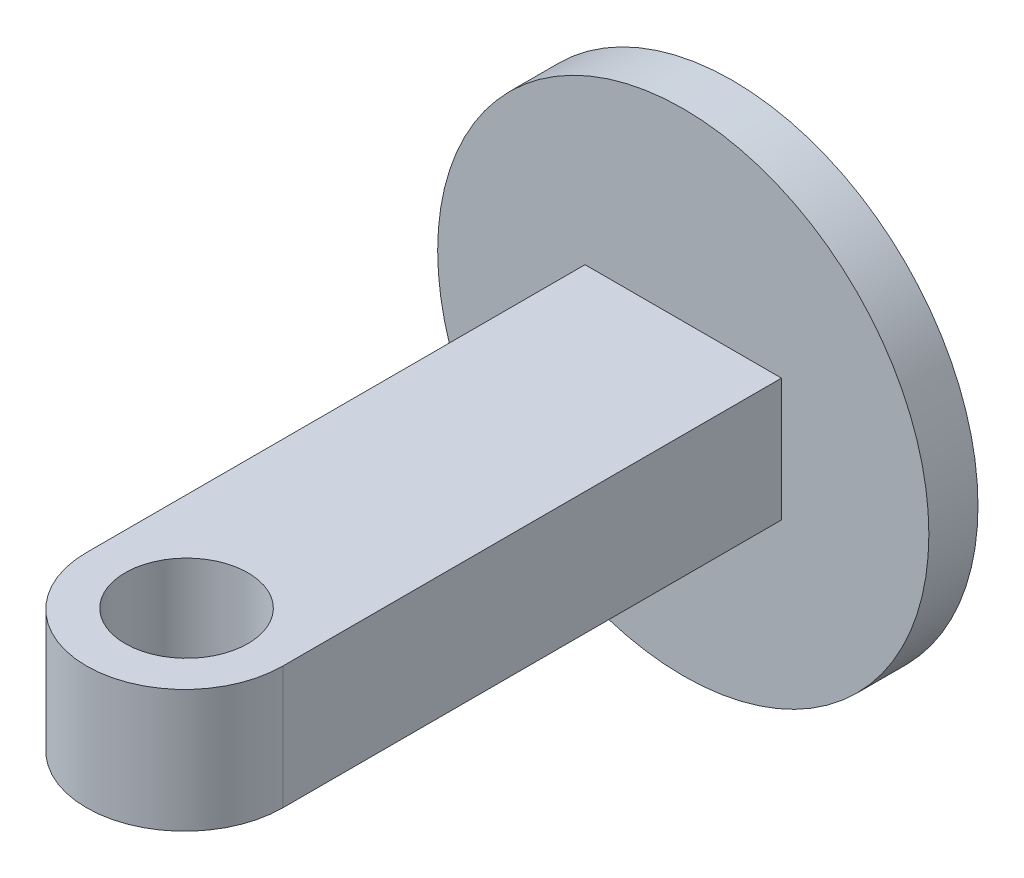
ISO-10303-21;
HEADER;
FILE_DESCRIPTION(('STEP AP214'),'2;1');
FILE_NAME('part.step','',(''),(''),'','','');
FILE_SCHEMA(('AUTOMOTIVE_DESIGN { 1 0 10303 214 1 1 1 1 }'));
ENDSEC;
DATA;
#1=APPLICATION_CONTEXT('core data for automotive mechanical design processes');
#2=APPLICATION_PROTOCOL_DEFINITION('international standard','automotive_design',2000,#1);
#3=PRODUCT_CONTEXT('',#1,'mechanical');
#4=PRODUCT('Part','Part','',(#3));
#5=PRODUCT_RELATED_PRODUCT_CATEGORY('part','',(#4));
#6=PRODUCT_DEFINITION_FORMATION('','',#4);
#7=PRODUCT_DEFINITION_CONTEXT('part definition',#1,'design');
#8=PRODUCT_DEFINITION('design','',#6,#7);
#9=PRODUCT_DEFINITION_SHAPE('','',#8);
#10=(LENGTH_UNIT() NAMED_UNIT(*) SI_UNIT(.MILLI.,.METRE.));
#11=(NAMED_UNIT(*) PLANE_ANGLE_UNIT() SI_UNIT($,.RADIAN.));
#12=(NAMED_UNIT(*) SI_UNIT($,.STERADIAN.) SOLID_ANGLE_UNIT());
#13=UNCERTAINTY_MEASURE_WITH_UNIT(LENGTH_MEASURE(1.E-05),#10,'distance_accuracy_value','');
#14=(GEOMETRIC_REPRESENTATION_CONTEXT(3) GLOBAL_UNCERTAINTY_ASSIGNED_CONTEXT((#13)) GLOBAL_UNIT_ASSIGNED_CONTEXT((#10,
#11,#12)) REPRESENTATION_CONTEXT('',''));
#15=CARTESIAN_POINT('',(0.,0.,0.));
#16=DIRECTION('',(0.,0.,1.));
#17=DIRECTION('',(1.,0.,0.));
#18=AXIS2_PLACEMENT_3D('',#15,#16,#17);
#19=CARTESIAN_POINT('',(0.,100.,0.));
#20=DIRECTION('',(0.,0.,-1.));
#21=DIRECTION('',(-1.,0.,0.));
#22=AXIS2_PLACEMENT_3D('',#19,#20,#21);
#23=CYLINDRICAL_SURFACE('',#22,100.);
#24=CARTESIAN_POINT('',(0.,100.,0.));
#25=DIRECTION('',(0.,0.,-1.));
#26=DIRECTION('',(-1.,0.,0.));
#27=AXIS2_PLACEMENT_3D('',#24,#25,#26);
#28=CIRCLE('',#27,100.);
#29=CARTESIAN_POINT('',(-100.,100.,0.));
#30=VERTEX_POINT('',#29);
#31=EDGE_CURVE('E11',#30,#30,#28,.T.);
#32=ORIENTED_EDGE('',*,*,#31,.F.);
#33=EDGE_LOOP('',(#32));
#34=FACE_BOUND('',#33,.T.);
#35=CARTESIAN_POINT('',(0.,100.,20.));
#36=DIRECTION('',(0.,0.,-1.));
#37=DIRECTION('',(-1.,0.,0.));
#38=AXIS2_PLACEMENT_3D('',#35,#36,#37);
#39=CIRCLE('',#38,100.);
#40=CARTESIAN_POINT('',(-100.,100.,20.));
#41=VERTEX_POINT('',#40);
#42=EDGE_CURVE('E53',#41,#41,#39,.T.);
#43=ORIENTED_EDGE('',*,*,#42,.T.);
#44=EDGE_LOOP('',(#43));
#45=FACE_BOUND('',#44,.T.);
#46=ADVANCED_FACE('F45',(#34,#45),#23,.T.);
#47=CARTESIAN_POINT('',(0.,0.,0.));
#48=DIRECTION('',(0.,0.,1.));
#49=DIRECTION('',(1.,0.,0.));
#50=AXIS2_PLACEMENT_3D('',#47,#48,#49);
#51=PLANE('',#50);
#52=ORIENTED_EDGE('',*,*,#31,.T.);
#53=EDGE_LOOP('',(#52));
#54=FACE_BOUND('',#53,.T.);
#55=ADVANCED_FACE('F143',(#54),#51,.F.);
#56=CARTESIAN_POINT('',(0.,100.,20.));
#57=DIRECTION('',(0.,0.,-1.));
#58=DIRECTION('',(-1.,0.,0.));
#59=AXIS2_PLACEMENT_3D('',#56,#57,#58);
#60=PLANE('',#59);
#61=DIRECTION('',(0.,-1.,0.));
#62=VECTOR('',#61,1.);
#63=CARTESIAN_POINT('',(40.,125.,20.));
#64=LINE('',#63,#62);
#65=CARTESIAN_POINT('',(40.,125.,20.));
#66=VERTEX_POINT('',#65);
#67=CARTESIAN_POINT('',(40.,75.,20.));
#68=VERTEX_POINT('',#67);
#69=EDGE_CURVE('E110',#66,#68,#64,.T.);
#70=ORIENTED_EDGE('',*,*,#69,.T.);
#71=DIRECTION('',(-1.,0.,0.));
#72=VECTOR('',#71,1.);
#73=CARTESIAN_POINT('',(-40.,75.,20.));
#74=LINE('',#73,#72);
#75=CARTESIAN_POINT('',(-40.,75.,20.));
#76=VERTEX_POINT('',#75);
#77=EDGE_CURVE('E60',#68,#76,#74,.T.);
#78=ORIENTED_EDGE('',*,*,#77,.T.);
#79=DIRECTION('',(0.,-1.,0.));
#80=VECTOR('',#79,1.);
#81=CARTESIAN_POINT('',(-40.,125.,20.));
#82=LINE('',#81,#80);
#83=CARTESIAN_POINT('',(-40.,125.,20.));
#84=VERTEX_POINT('',#83);
#85=EDGE_CURVE('E86',#84,#76,#82,.T.);
#86=ORIENTED_EDGE('',*,*,#85,.F.);
#87=DIRECTION('',(-1.,0.,0.));
#88=VECTOR('',#87,1.);
#89=CARTESIAN_POINT('',(-40.,125.,20.));
#90=LINE('',#89,#88);
#91=EDGE_CURVE('E69',#66,#84,#90,.T.);
#92=ORIENTED_EDGE('',*,*,#91,.F.);
#93=EDGE_LOOP('',(#70,#78,#86,#92));
#94=FACE_BOUND('',#93,.T.);
#95=ORIENTED_EDGE('',*,*,#42,.F.);
#96=EDGE_LOOP('',(#95));
#97=FACE_BOUND('',#96,.T.);
#98=ADVANCED_FACE('F141',(#94,#97),#60,.F.);
#99=CARTESIAN_POINT('',(0.,125.,223.));
#100=DIRECTION('',(0.,-1.,0.));
#101=DIRECTION('',(0.,0.,-1.));
#102=AXIS2_PLACEMENT_3D('',#99,#100,#101);
#103=PLANE('',#102);
#104=DIRECTION('',(0.,0.,1.));
#105=VECTOR('',#104,1.);
#106=CARTESIAN_POINT('',(-40.,125.,20.));
#107=LINE('',#106,#105);
#108=CARTESIAN_POINT('',(-40.,125.,223.));
#109=VERTEX_POINT('',#108);
#110=EDGE_CURVE('E99',#84,#109,#107,.T.);
#111=ORIENTED_EDGE('',*,*,#110,.T.);
#112=CARTESIAN_POINT('',(0.,125.,223.));
#113=DIRECTION('',(0.,1.,0.));
#114=DIRECTION('',(0.,0.,-1.));
#115=AXIS2_PLACEMENT_3D('',#112,#113,#114);
#116=CIRCLE('',#115,40.);
#117=CARTESIAN_POINT('',(40.,125.,223.));
#118=VERTEX_POINT('',#117);
#119=EDGE_CURVE('E93',#109,#118,#116,.T.);
#120=ORIENTED_EDGE('',*,*,#119,.T.);
#121=DIRECTION('',(0.,0.,-1.));
#122=VECTOR('',#121,1.);
#123=CARTESIAN_POINT('',(40.,125.,20.));
#124=LINE('',#123,#122);
#125=EDGE_CURVE('E97',#118,#66,#124,.T.);
#126=ORIENTED_EDGE('',*,*,#125,.T.);
#127=ORIENTED_EDGE('',*,*,#91,.T.);
#128=EDGE_LOOP('',(#111,#120,#126,#127));
#129=FACE_BOUND('',#128,.T.);
#130=CARTESIAN_POINT('',(0.,125.,222.24));
#131=DIRECTION('',(0.,1.,0.));
#132=DIRECTION('',(0.,0.,1.));
#133=AXIS2_PLACEMENT_3D('',#130,#131,#132);
#134=CIRCLE('',#133,25.);
#135=CARTESIAN_POINT('',(0.,125.,247.24));
#136=VERTEX_POINT('',#135);
#137=EDGE_CURVE('E123',#136,#136,#134,.T.);
#138=ORIENTED_EDGE('',*,*,#137,.F.);
#139=EDGE_LOOP('',(#138));
#140=FACE_BOUND('',#139,.T.);
#141=ADVANCED_FACE('F94',(#129,#140),#103,.F.);
#142=CARTESIAN_POINT('',(0.,75.,223.));
#143=DIRECTION('',(0.,-1.,0.));
#144=DIRECTION('',(0.,0.,-1.));
#145=AXIS2_PLACEMENT_3D('',#142,#143,#144);
#146=PLANE('',#145);
#147=DIRECTION('',(0.,0.,1.));
#148=VECTOR('',#147,1.);
#149=CARTESIAN_POINT('',(-40.,75.,20.));
#150=LINE('',#149,#148);
#151=CARTESIAN_POINT('',(-40.,75.,223.));
#152=VERTEX_POINT('',#151);
#153=EDGE_CURVE('E120',#76,#152,#150,.T.);
#154=ORIENTED_EDGE('',*,*,#153,.F.);
#155=ORIENTED_EDGE('',*,*,#77,.F.);
#156=DIRECTION('',(0.,0.,-1.));
#157=VECTOR('',#156,1.);
#158=CARTESIAN_POINT('',(40.,75.,20.));
#159=LINE('',#158,#157);
#160=CARTESIAN_POINT('',(40.,75.,223.));
#161=VERTEX_POINT('',#160);
#162=EDGE_CURVE('E126',#161,#68,#159,.T.);
#163=ORIENTED_EDGE('',*,*,#162,.F.);
#164=CARTESIAN_POINT('',(0.,75.,223.));
#165=DIRECTION('',(0.,1.,0.));
#166=DIRECTION('',(0.,0.,-1.));
#167=AXIS2_PLACEMENT_3D('',#164,#165,#166);
#168=CIRCLE('',#167,40.);
#169=EDGE_CURVE('E106',#152,#161,#168,.T.);
#170=ORIENTED_EDGE('',*,*,#169,.F.);
#171=EDGE_LOOP('',(#154,#155,#163,#170));
#172=FACE_BOUND('',#171,.T.);
#173=CARTESIAN_POINT('',(0.,75.,222.24));
#174=DIRECTION('',(0.,1.,0.));
#175=DIRECTION('',(0.,0.,1.));
#176=AXIS2_PLACEMENT_3D('',#173,#174,#175);
#177=CIRCLE('',#176,25.);
#178=CARTESIAN_POINT('',(0.,75.,247.24));
#179=VERTEX_POINT('',#178);
#180=EDGE_CURVE('E225',#179,#179,#177,.T.);
#181=ORIENTED_EDGE('',*,*,#180,.T.);
#182=EDGE_LOOP('',(#181));
#183=FACE_BOUND('',#182,.T.);
#184=ADVANCED_FACE('F150',(#172,#183),#146,.T.);
#185=CARTESIAN_POINT('',(-40.,125.,20.));
#186=DIRECTION('',(1.,0.,0.));
#187=DIRECTION('',(0.,0.,-1.));
#188=AXIS2_PLACEMENT_3D('',#185,#186,#187);
#189=PLANE('',#188);
#190=ORIENTED_EDGE('',*,*,#153,.T.);
#191=DIRECTION('',(0.,-1.,0.));
#192=VECTOR('',#191,1.);
#193=CARTESIAN_POINT('',(-40.,125.,223.));
#194=LINE('',#193,#192);
#195=EDGE_CURVE('E109',#109,#152,#194,.T.);
#196=ORIENTED_EDGE('',*,*,#195,.F.);
#197=ORIENTED_EDGE('',*,*,#110,.F.);
#198=ORIENTED_EDGE('',*,*,#85,.T.);
#199=EDGE_LOOP('',(#190,#196,#197,#198));
#200=FACE_BOUND('',#199,.T.);
#201=ADVANCED_FACE('F184',(#200),#189,.F.);
#202=CARTESIAN_POINT('',(0.,125.,223.));
#203=DIRECTION('',(0.,-1.,0.));
#204=DIRECTION('',(0.,0.,-1.));
#205=AXIS2_PLACEMENT_3D('',#202,#203,#204);
#206=CYLINDRICAL_SURFACE('',#205,40.);
#207=ORIENTED_EDGE('',*,*,#169,.T.);
#208=DIRECTION('',(0.,-1.,0.));
#209=VECTOR('',#208,1.);
#210=CARTESIAN_POINT('',(40.,125.,223.));
#211=LINE('',#210,#209);
#212=EDGE_CURVE('E104',#118,#161,#211,.T.);
#213=ORIENTED_EDGE('',*,*,#212,.F.);
#214=ORIENTED_EDGE('',*,*,#119,.F.);
#215=ORIENTED_EDGE('',*,*,#195,.T.);
#216=EDGE_LOOP('',(#207,#213,#214,#215));
#217=FACE_BOUND('',#216,.T.);
#218=ADVANCED_FACE('F105',(#217),#206,.T.);
#219=CARTESIAN_POINT('',(40.,125.,20.));
#220=DIRECTION('',(-1.,0.,0.));
#221=DIRECTION('',(0.,0.,1.));
#222=AXIS2_PLACEMENT_3D('',#219,#220,#221);
#223=PLANE('',#222);
#224=ORIENTED_EDGE('',*,*,#162,.T.);
#225=ORIENTED_EDGE('',*,*,#69,.F.);
#226=ORIENTED_EDGE('',*,*,#125,.F.);
#227=ORIENTED_EDGE('',*,*,#212,.T.);
#228=EDGE_LOOP('',(#224,#225,#226,#227));
#229=FACE_BOUND('',#228,.T.);
#230=ADVANCED_FACE('F112',(#229),#223,.F.);
#231=CARTESIAN_POINT('',(0.,125.,222.24));
#232=DIRECTION('',(0.,-1.,0.));
#233=DIRECTION('',(0.,0.,-1.));
#234=AXIS2_PLACEMENT_3D('',#231,#232,#233);
#235=CYLINDRICAL_SURFACE('',#234,25.);
#236=ORIENTED_EDGE('',*,*,#137,.T.);
#237=EDGE_LOOP('',(#236));
#238=FACE_BOUND('',#237,.T.);
#239=ORIENTED_EDGE('',*,*,#180,.F.);
#240=EDGE_LOOP('',(#239));
#241=FACE_BOUND('',#240,.T.);
#242=ADVANCED_FACE('F208',(#238,#241),#235,.F.);
#243=CLOSED_SHELL('',(#46,#55,#98,#141,#184,#201,#218,#230,#242));
#244=MANIFOLD_SOLID_BREP('B2',#243);
#245=ADVANCED_BREP_SHAPE_REPRESENTATION('',(#18,#244),#14);
#246=SHAPE_DEFINITION_REPRESENTATION(#9,#245);
ENDSEC;
END-ISO-10303-21;
